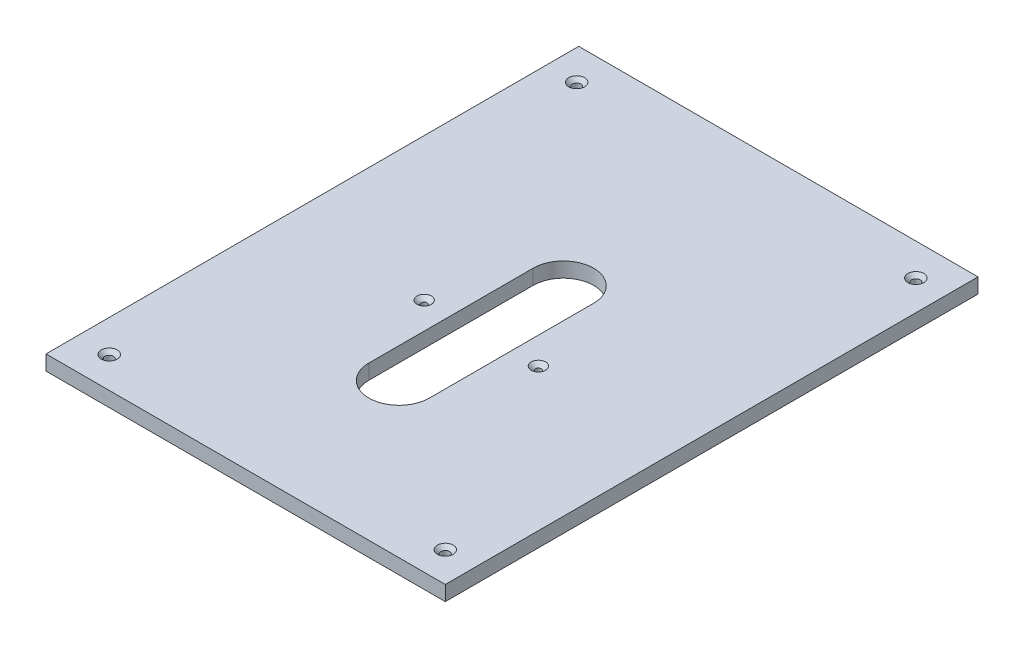
ISO-10303-21;
HEADER;
FILE_DESCRIPTION(('STEP AP214'),'2;1');
FILE_NAME('part.step','',(''),(''),'','','');
FILE_SCHEMA(('AUTOMOTIVE_DESIGN { 1 0 10303 214 1 1 1 1 }'));
ENDSEC;
DATA;
#1=APPLICATION_CONTEXT('core data for automotive mechanical design processes');
#2=APPLICATION_PROTOCOL_DEFINITION('international standard','automotive_design',2000,#1);
#3=PRODUCT_CONTEXT('',#1,'mechanical');
#4=PRODUCT('Part','Part','',(#3));
#5=PRODUCT_RELATED_PRODUCT_CATEGORY('part','',(#4));
#6=PRODUCT_DEFINITION_FORMATION('','',#4);
#7=PRODUCT_DEFINITION_CONTEXT('part definition',#1,'design');
#8=PRODUCT_DEFINITION('design','',#6,#7);
#9=PRODUCT_DEFINITION_SHAPE('','',#8);
#10=(LENGTH_UNIT() NAMED_UNIT(*) SI_UNIT(.MILLI.,.METRE.));
#11=(NAMED_UNIT(*) PLANE_ANGLE_UNIT() SI_UNIT($,.RADIAN.));
#12=(NAMED_UNIT(*) SI_UNIT($,.STERADIAN.) SOLID_ANGLE_UNIT());
#13=UNCERTAINTY_MEASURE_WITH_UNIT(LENGTH_MEASURE(1.E-05),#10,'distance_accuracy_value','');
#14=(GEOMETRIC_REPRESENTATION_CONTEXT(3) GLOBAL_UNCERTAINTY_ASSIGNED_CONTEXT((#13)) GLOBAL_UNIT_ASSIGNED_CONTEXT((#10,
#11,#12)) REPRESENTATION_CONTEXT('',''));
#15=CARTESIAN_POINT('',(0.,0.,0.));
#16=DIRECTION('',(0.,0.,1.));
#17=DIRECTION('',(1.,0.,0.));
#18=AXIS2_PLACEMENT_3D('',#15,#16,#17);
#19=CARTESIAN_POINT('',(79.,5.9,-105.4));
#20=DIRECTION('',(-1.,0.,0.));
#21=DIRECTION('',(0.,0.,1.));
#22=AXIS2_PLACEMENT_3D('',#19,#20,#21);
#23=PLANE('',#22);
#24=DIRECTION('',(0.,0.,-1.));
#25=VECTOR('',#24,1.);
#26=CARTESIAN_POINT('',(79.,0.,-105.4));
#27=LINE('',#26,#25);
#28=CARTESIAN_POINT('',(79.,0.,105.4));
#29=VERTEX_POINT('',#28);
#30=CARTESIAN_POINT('',(79.,0.,-105.4));
#31=VERTEX_POINT('',#30);
#32=EDGE_CURVE('E202',#29,#31,#27,.T.);
#33=ORIENTED_EDGE('',*,*,#32,.T.);
#34=DIRECTION('',(0.,-1.,0.));
#35=VECTOR('',#34,1.);
#36=CARTESIAN_POINT('',(79.,5.9,-105.4));
#37=LINE('',#36,#35);
#38=CARTESIAN_POINT('',(79.,5.9,-105.4));
#39=VERTEX_POINT('',#38);
#40=EDGE_CURVE('E11',#39,#31,#37,.T.);
#41=ORIENTED_EDGE('',*,*,#40,.F.);
#42=DIRECTION('',(0.,0.,-1.));
#43=VECTOR('',#42,1.);
#44=CARTESIAN_POINT('',(79.,5.9,-105.4));
#45=LINE('',#44,#43);
#46=CARTESIAN_POINT('',(79.,5.9,105.4));
#47=VERTEX_POINT('',#46);
#48=EDGE_CURVE('E191',#47,#39,#45,.T.);
#49=ORIENTED_EDGE('',*,*,#48,.F.);
#50=DIRECTION('',(0.,-1.,0.));
#51=VECTOR('',#50,1.);
#52=CARTESIAN_POINT('',(79.,5.9,105.4));
#53=LINE('',#52,#51);
#54=EDGE_CURVE('E201',#47,#29,#53,.T.);
#55=ORIENTED_EDGE('',*,*,#54,.T.);
#56=EDGE_LOOP('',(#33,#41,#49,#55));
#57=FACE_BOUND('',#56,.T.);
#58=ADVANCED_FACE('F37',(#57),#23,.F.);
#59=CARTESIAN_POINT('',(-79.,5.9,-105.4));
#60=DIRECTION('',(0.,0.,1.));
#61=DIRECTION('',(1.,0.,0.));
#62=AXIS2_PLACEMENT_3D('',#59,#60,#61);
#63=PLANE('',#62);
#64=DIRECTION('',(-1.,0.,0.));
#65=VECTOR('',#64,1.);
#66=CARTESIAN_POINT('',(-79.,0.,-105.4));
#67=LINE('',#66,#65);
#68=CARTESIAN_POINT('',(-79.,0.,-105.4));
#69=VERTEX_POINT('',#68);
#70=EDGE_CURVE('E205',#31,#69,#67,.T.);
#71=ORIENTED_EDGE('',*,*,#70,.T.);
#72=DIRECTION('',(0.,-1.,0.));
#73=VECTOR('',#72,1.);
#74=CARTESIAN_POINT('',(-79.,5.9,-105.4));
#75=LINE('',#74,#73);
#76=CARTESIAN_POINT('',(-79.,5.9,-105.4));
#77=VERTEX_POINT('',#76);
#78=EDGE_CURVE('E45',#77,#69,#75,.T.);
#79=ORIENTED_EDGE('',*,*,#78,.F.);
#80=DIRECTION('',(-1.,0.,0.));
#81=VECTOR('',#80,1.);
#82=CARTESIAN_POINT('',(-79.,5.9,-105.4));
#83=LINE('',#82,#81);
#84=EDGE_CURVE('E194',#39,#77,#83,.T.);
#85=ORIENTED_EDGE('',*,*,#84,.F.);
#86=ORIENTED_EDGE('',*,*,#40,.T.);
#87=EDGE_LOOP('',(#71,#79,#85,#86));
#88=FACE_BOUND('',#87,.T.);
#89=ADVANCED_FACE('F269',(#88),#63,.F.);
#90=CARTESIAN_POINT('',(-79.,5.9,-105.4));
#91=DIRECTION('',(1.,0.,0.));
#92=DIRECTION('',(0.,0.,-1.));
#93=AXIS2_PLACEMENT_3D('',#90,#91,#92);
#94=PLANE('',#93);
#95=DIRECTION('',(0.,0.,1.));
#96=VECTOR('',#95,1.);
#97=CARTESIAN_POINT('',(-79.,0.,-105.4));
#98=LINE('',#97,#96);
#99=CARTESIAN_POINT('',(-79.,0.,105.4));
#100=VERTEX_POINT('',#99);
#101=EDGE_CURVE('E207',#69,#100,#98,.T.);
#102=ORIENTED_EDGE('',*,*,#101,.T.);
#103=DIRECTION('',(0.,-1.,0.));
#104=VECTOR('',#103,1.);
#105=CARTESIAN_POINT('',(-79.,5.9,105.4));
#106=LINE('',#105,#104);
#107=CARTESIAN_POINT('',(-79.,5.9,105.4));
#108=VERTEX_POINT('',#107);
#109=EDGE_CURVE('E212',#108,#100,#106,.T.);
#110=ORIENTED_EDGE('',*,*,#109,.F.);
#111=DIRECTION('',(0.,0.,1.));
#112=VECTOR('',#111,1.);
#113=CARTESIAN_POINT('',(-79.,5.9,-105.4));
#114=LINE('',#113,#112);
#115=EDGE_CURVE('E197',#77,#108,#114,.T.);
#116=ORIENTED_EDGE('',*,*,#115,.F.);
#117=ORIENTED_EDGE('',*,*,#78,.T.);
#118=EDGE_LOOP('',(#102,#110,#116,#117));
#119=FACE_BOUND('',#118,.T.);
#120=ADVANCED_FACE('F274',(#119),#94,.F.);
#121=CARTESIAN_POINT('',(-79.,5.9,105.4));
#122=DIRECTION('',(0.,0.,-1.));
#123=DIRECTION('',(-1.,0.,0.));
#124=AXIS2_PLACEMENT_3D('',#121,#122,#123);
#125=PLANE('',#124);
#126=DIRECTION('',(1.,0.,0.));
#127=VECTOR('',#126,1.);
#128=CARTESIAN_POINT('',(-79.,0.,105.4));
#129=LINE('',#128,#127);
#130=EDGE_CURVE('E195',#100,#29,#129,.T.);
#131=ORIENTED_EDGE('',*,*,#130,.T.);
#132=ORIENTED_EDGE('',*,*,#54,.F.);
#133=DIRECTION('',(1.,0.,0.));
#134=VECTOR('',#133,1.);
#135=CARTESIAN_POINT('',(-79.,5.9,105.4));
#136=LINE('',#135,#134);
#137=EDGE_CURVE('E199',#108,#47,#136,.T.);
#138=ORIENTED_EDGE('',*,*,#137,.F.);
#139=ORIENTED_EDGE('',*,*,#109,.T.);
#140=EDGE_LOOP('',(#131,#132,#138,#139));
#141=FACE_BOUND('',#140,.T.);
#142=ADVANCED_FACE('F248',(#141),#125,.F.);
#143=CARTESIAN_POINT('',(0.,5.9,0.));
#144=DIRECTION('',(0.,1.,0.));
#145=DIRECTION('',(0.,0.,1.));
#146=AXIS2_PLACEMENT_3D('',#143,#144,#145);
#147=PLANE('',#146);
#148=CARTESIAN_POINT('',(-22.6,5.9,12.16));
#149=DIRECTION('',(0.,1.,0.));
#150=DIRECTION('',(0.,0.,1.));
#151=AXIS2_PLACEMENT_3D('',#148,#149,#150);
#152=CIRCLE('',#151,2.8575);
#153=CARTESIAN_POINT('',(-22.6,5.9,15.0175));
#154=VERTEX_POINT('',#153);
#155=EDGE_CURVE('E239',#154,#154,#152,.T.);
#156=ORIENTED_EDGE('',*,*,#155,.F.);
#157=EDGE_LOOP('',(#156));
#158=FACE_BOUND('',#157,.T.);
#159=CARTESIAN_POINT('',(22.6,5.9,12.16));
#160=DIRECTION('',(0.,1.,0.));
#161=DIRECTION('',(0.,0.,1.));
#162=AXIS2_PLACEMENT_3D('',#159,#160,#161);
#163=CIRCLE('',#162,2.8575);
#164=CARTESIAN_POINT('',(22.6,5.9,15.0175));
#165=VERTEX_POINT('',#164);
#166=EDGE_CURVE('E228',#165,#165,#163,.T.);
#167=ORIENTED_EDGE('',*,*,#166,.F.);
#168=EDGE_LOOP('',(#167));
#169=FACE_BOUND('',#168,.T.);
#170=CARTESIAN_POINT('',(-11.991361003824,5.9,44.66));
#171=CARTESIAN_POINT('',(-11.991361003824,5.9,68.642722007648));
#172=CARTESIAN_POINT('',(11.991361003824,5.9,68.642722007648));
#173=CARTESIAN_POINT('',(11.991361003824,5.9,44.66));
#174=(BOUNDED_CURVE() B_SPLINE_CURVE(3,(#170,#171,#172,#173),.UNSPECIFIED.,.F.,
.F.) B_SPLINE_CURVE_WITH_KNOTS((4,4),(0.,1.),
.UNSPECIFIED.) CURVE() GEOMETRIC_REPRESENTATION_ITEM() RATIONAL_B_SPLINE_CURVE((1.,
0.333333333333333,0.333333333333333,1.)) REPRESENTATION_ITEM(''));
#175=CARTESIAN_POINT('',(-11.991361003824,5.9,44.66));
#176=VERTEX_POINT('',#175);
#177=CARTESIAN_POINT('',(11.991361003824,5.9,44.66));
#178=VERTEX_POINT('',#177);
#179=EDGE_CURVE('E53',#176,#178,#174,.T.);
#180=ORIENTED_EDGE('',*,*,#179,.F.);
#181=DIRECTION('',(0.,0.,1.));
#182=VECTOR('',#181,1.);
#183=CARTESIAN_POINT('',(-11.991361003824,5.9,-20.34));
#184=LINE('',#183,#182);
#185=CARTESIAN_POINT('',(-11.991361003824,5.9,-20.34));
#186=VERTEX_POINT('',#185);
#187=EDGE_CURVE('E121',#186,#176,#184,.T.);
#188=ORIENTED_EDGE('',*,*,#187,.F.);
#189=CARTESIAN_POINT('',(11.991361003824,5.9,-20.34));
#190=CARTESIAN_POINT('',(11.991361003824,5.9,-44.322722007648));
#191=CARTESIAN_POINT('',(-11.991361003824,5.9,-44.322722007648));
#192=CARTESIAN_POINT('',(-11.991361003824,5.9,-20.34));
#193=(BOUNDED_CURVE() B_SPLINE_CURVE(3,(#189,#190,#191,#192),.UNSPECIFIED.,.F.,
.F.) B_SPLINE_CURVE_WITH_KNOTS((4,4),(0.,1.),
.UNSPECIFIED.) CURVE() GEOMETRIC_REPRESENTATION_ITEM() RATIONAL_B_SPLINE_CURVE((1.,
0.333333333333334,0.333333333333334,1.)) REPRESENTATION_ITEM(''));
#194=CARTESIAN_POINT('',(11.991361003824,5.9,-20.34));
#195=VERTEX_POINT('',#194);
#196=EDGE_CURVE('E124',#195,#186,#193,.T.);
#197=ORIENTED_EDGE('',*,*,#196,.F.);
#198=DIRECTION('',(0.,0.,-1.));
#199=VECTOR('',#198,1.);
#200=CARTESIAN_POINT('',(11.991361003824,5.9,44.66));
#201=LINE('',#200,#199);
#202=EDGE_CURVE('E145',#178,#195,#201,.T.);
#203=ORIENTED_EDGE('',*,*,#202,.F.);
#204=EDGE_LOOP('',(#180,#188,#197,#203));
#205=FACE_BOUND('',#204,.T.);
#206=CARTESIAN_POINT('',(67.1,5.9,-92.7));
#207=DIRECTION('',(0.,1.,0.));
#208=DIRECTION('',(0.,0.,1.));
#209=AXIS2_PLACEMENT_3D('',#206,#207,#208);
#210=CIRCLE('',#209,3.15);
#211=CARTESIAN_POINT('',(67.1,5.9,-89.55));
#212=VERTEX_POINT('',#211);
#213=EDGE_CURVE('E160',#212,#212,#210,.T.);
#214=ORIENTED_EDGE('',*,*,#213,.F.);
#215=EDGE_LOOP('',(#214));
#216=FACE_BOUND('',#215,.T.);
#217=CARTESIAN_POINT('',(67.1,5.9,93.4999999999999));
#218=DIRECTION('',(0.,1.,0.));
#219=DIRECTION('',(0.,0.,1.));
#220=AXIS2_PLACEMENT_3D('',#217,#218,#219);
#221=CIRCLE('',#220,3.15);
#222=CARTESIAN_POINT('',(67.1,5.9,96.6499999999999));
#223=VERTEX_POINT('',#222);
#224=EDGE_CURVE('E170',#223,#223,#221,.T.);
#225=ORIENTED_EDGE('',*,*,#224,.F.);
#226=EDGE_LOOP('',(#225));
#227=FACE_BOUND('',#226,.T.);
#228=CARTESIAN_POINT('',(-66.2839765904719,5.9,93.1));
#229=DIRECTION('',(0.,1.,0.));
#230=DIRECTION('',(0.,0.,1.));
#231=AXIS2_PLACEMENT_3D('',#228,#229,#230);
#232=CIRCLE('',#231,3.15);
#233=CARTESIAN_POINT('',(-66.2839765904719,5.9,96.2499999999999));
#234=VERTEX_POINT('',#233);
#235=EDGE_CURVE('E177',#234,#234,#232,.T.);
#236=ORIENTED_EDGE('',*,*,#235,.F.);
#237=EDGE_LOOP('',(#236));
#238=FACE_BOUND('',#237,.T.);
#239=CARTESIAN_POINT('',(-67.1,5.9,-92.7));
#240=DIRECTION('',(0.,1.,0.));
#241=DIRECTION('',(0.,0.,1.));
#242=AXIS2_PLACEMENT_3D('',#239,#240,#241);
#243=CIRCLE('',#242,3.15);
#244=CARTESIAN_POINT('',(-67.1,5.9,-89.55));
#245=VERTEX_POINT('',#244);
#246=EDGE_CURVE('E184',#245,#245,#243,.T.);
#247=ORIENTED_EDGE('',*,*,#246,.F.);
#248=EDGE_LOOP('',(#247));
#249=FACE_BOUND('',#248,.T.);
#250=ORIENTED_EDGE('',*,*,#48,.T.);
#251=ORIENTED_EDGE('',*,*,#84,.T.);
#252=ORIENTED_EDGE('',*,*,#115,.T.);
#253=ORIENTED_EDGE('',*,*,#137,.T.);
#254=EDGE_LOOP('',(#250,#251,#252,#253));
#255=FACE_BOUND('',#254,.T.);
#256=ADVANCED_FACE('F245',(#158,#169,#205,#216,#227,#238,#249,#255),#147,.T.);
#257=CARTESIAN_POINT('',(0.,0.,0.));
#258=DIRECTION('',(0.,1.,0.));
#259=DIRECTION('',(0.,0.,1.));
#260=AXIS2_PLACEMENT_3D('',#257,#258,#259);
#261=PLANE('',#260);
#262=CARTESIAN_POINT('',(-22.6,0.,12.16));
#263=DIRECTION('',(0.,1.,0.));
#264=DIRECTION('',(0.,0.,1.));
#265=AXIS2_PLACEMENT_3D('',#262,#263,#264);
#266=CIRCLE('',#265,1.1303);
#267=CARTESIAN_POINT('',(-22.6,0.,13.2903));
#268=VERTEX_POINT('',#267);
#269=EDGE_CURVE('E40',#268,#268,#266,.T.);
#270=ORIENTED_EDGE('',*,*,#269,.T.);
#271=EDGE_LOOP('',(#270));
#272=FACE_BOUND('',#271,.T.);
#273=CARTESIAN_POINT('',(22.6,0.,12.16));
#274=DIRECTION('',(0.,1.,0.));
#275=DIRECTION('',(0.,0.,1.));
#276=AXIS2_PLACEMENT_3D('',#273,#274,#275);
#277=CIRCLE('',#276,1.1303);
#278=CARTESIAN_POINT('',(22.6,0.,13.2903));
#279=VERTEX_POINT('',#278);
#280=EDGE_CURVE('E146',#279,#279,#277,.T.);
#281=ORIENTED_EDGE('',*,*,#280,.T.);
#282=EDGE_LOOP('',(#281));
#283=FACE_BOUND('',#282,.T.);
#284=DIRECTION('',(0.,0.,1.));
#285=VECTOR('',#284,1.);
#286=CARTESIAN_POINT('',(-11.991361003824,0.,-20.34));
#287=LINE('',#286,#285);
#288=CARTESIAN_POINT('',(-11.991361003824,0.,-20.34));
#289=VERTEX_POINT('',#288);
#290=CARTESIAN_POINT('',(-11.991361003824,0.,44.66));
#291=VERTEX_POINT('',#290);
#292=EDGE_CURVE('E111',#289,#291,#287,.T.);
#293=ORIENTED_EDGE('',*,*,#292,.T.);
#294=CARTESIAN_POINT('',(-11.991361003824,0.,44.66));
#295=CARTESIAN_POINT('',(-11.991361003824,0.,68.642722007648));
#296=CARTESIAN_POINT('',(11.991361003824,0.,68.642722007648));
#297=CARTESIAN_POINT('',(11.991361003824,0.,44.66));
#298=(BOUNDED_CURVE() B_SPLINE_CURVE(3,(#294,#295,#296,#297),.UNSPECIFIED.,.F.,
.F.) B_SPLINE_CURVE_WITH_KNOTS((4,4),(0.,1.),
.UNSPECIFIED.) CURVE() GEOMETRIC_REPRESENTATION_ITEM() RATIONAL_B_SPLINE_CURVE((1.,
0.333333333333333,0.333333333333333,1.)) REPRESENTATION_ITEM(''));
#299=CARTESIAN_POINT('',(11.991361003824,0.,44.66));
#300=VERTEX_POINT('',#299);
#301=EDGE_CURVE('E105',#291,#300,#298,.T.);
#302=ORIENTED_EDGE('',*,*,#301,.T.);
#303=DIRECTION('',(0.,0.,-1.));
#304=VECTOR('',#303,1.);
#305=CARTESIAN_POINT('',(11.991361003824,0.,44.66));
#306=LINE('',#305,#304);
#307=CARTESIAN_POINT('',(11.991361003824,0.,-20.34));
#308=VERTEX_POINT('',#307);
#309=EDGE_CURVE('E114',#300,#308,#306,.T.);
#310=ORIENTED_EDGE('',*,*,#309,.T.);
#311=CARTESIAN_POINT('',(11.991361003824,0.,-20.34));
#312=CARTESIAN_POINT('',(11.991361003824,0.,-44.322722007648));
#313=CARTESIAN_POINT('',(-11.991361003824,0.,-44.322722007648));
#314=CARTESIAN_POINT('',(-11.991361003824,0.,-20.34));
#315=(BOUNDED_CURVE() B_SPLINE_CURVE(3,(#311,#312,#313,#314),.UNSPECIFIED.,.F.,
.F.) B_SPLINE_CURVE_WITH_KNOTS((4,4),(0.,1.),
.UNSPECIFIED.) CURVE() GEOMETRIC_REPRESENTATION_ITEM() RATIONAL_B_SPLINE_CURVE((1.,
0.333333333333334,0.333333333333334,1.)) REPRESENTATION_ITEM(''));
#316=EDGE_CURVE('E61',#308,#289,#315,.T.);
#317=ORIENTED_EDGE('',*,*,#316,.T.);
#318=EDGE_LOOP('',(#293,#302,#310,#317));
#319=FACE_BOUND('',#318,.T.);
#320=CARTESIAN_POINT('',(67.1,0.,-92.7));
#321=DIRECTION('',(0.,1.,0.));
#322=DIRECTION('',(0.,0.,1.));
#323=AXIS2_PLACEMENT_3D('',#320,#321,#322);
#324=CIRCLE('',#323,1.69999999999999);
#325=CARTESIAN_POINT('',(67.1,0.,-91.));
#326=VERTEX_POINT('',#325);
#327=EDGE_CURVE('E169',#326,#326,#324,.T.);
#328=ORIENTED_EDGE('',*,*,#327,.T.);
#329=EDGE_LOOP('',(#328));
#330=FACE_BOUND('',#329,.T.);
#331=CARTESIAN_POINT('',(67.1,0.,93.4999999999999));
#332=DIRECTION('',(0.,1.,0.));
#333=DIRECTION('',(0.,0.,1.));
#334=AXIS2_PLACEMENT_3D('',#331,#332,#333);
#335=CIRCLE('',#334,1.69999999999999);
#336=CARTESIAN_POINT('',(67.1,0.,95.1999999999999));
#337=VERTEX_POINT('',#336);
#338=EDGE_CURVE('E176',#337,#337,#335,.T.);
#339=ORIENTED_EDGE('',*,*,#338,.T.);
#340=EDGE_LOOP('',(#339));
#341=FACE_BOUND('',#340,.T.);
#342=CARTESIAN_POINT('',(-66.2839765904719,0.,93.1));
#343=DIRECTION('',(0.,1.,0.));
#344=DIRECTION('',(0.,0.,1.));
#345=AXIS2_PLACEMENT_3D('',#342,#343,#344);
#346=CIRCLE('',#345,1.69999999999999);
#347=CARTESIAN_POINT('',(-66.2839765904719,0.,94.7999999999999));
#348=VERTEX_POINT('',#347);
#349=EDGE_CURVE('E183',#348,#348,#346,.T.);
#350=ORIENTED_EDGE('',*,*,#349,.T.);
#351=EDGE_LOOP('',(#350));
#352=FACE_BOUND('',#351,.T.);
#353=CARTESIAN_POINT('',(-67.1,0.,-92.7));
#354=DIRECTION('',(0.,1.,0.));
#355=DIRECTION('',(0.,0.,1.));
#356=AXIS2_PLACEMENT_3D('',#353,#354,#355);
#357=CIRCLE('',#356,1.69999999999999);
#358=CARTESIAN_POINT('',(-67.1,0.,-91.));
#359=VERTEX_POINT('',#358);
#360=EDGE_CURVE('E190',#359,#359,#357,.T.);
#361=ORIENTED_EDGE('',*,*,#360,.T.);
#362=EDGE_LOOP('',(#361));
#363=FACE_BOUND('',#362,.T.);
#364=ORIENTED_EDGE('',*,*,#32,.F.);
#365=ORIENTED_EDGE('',*,*,#130,.F.);
#366=ORIENTED_EDGE('',*,*,#101,.F.);
#367=ORIENTED_EDGE('',*,*,#70,.F.);
#368=EDGE_LOOP('',(#364,#365,#366,#367));
#369=FACE_BOUND('',#368,.T.);
#370=ADVANCED_FACE('F118',(#272,#283,#319,#330,#341,#352,#363,#369),#261,.F.);
#371=CARTESIAN_POINT('',(-67.1,5.9,-92.7));
#372=DIRECTION('',(0.,1.,0.));
#373=DIRECTION('',(0.,0.,1.));
#374=AXIS2_PLACEMENT_3D('',#371,#372,#373);
#375=CYLINDRICAL_SURFACE('',#374,1.69999999999999);
#376=CARTESIAN_POINT('',(-67.1,4.45,-92.7));
#377=DIRECTION('',(0.,1.,0.));
#378=DIRECTION('',(0.,0.,1.));
#379=AXIS2_PLACEMENT_3D('',#376,#377,#378);
#380=CIRCLE('',#379,1.69999999999999);
#381=CARTESIAN_POINT('',(-67.1,4.45,-91.));
#382=VERTEX_POINT('',#381);
#383=EDGE_CURVE('E187',#382,#382,#380,.T.);
#384=ORIENTED_EDGE('',*,*,#383,.T.);
#385=EDGE_LOOP('',(#384));
#386=FACE_BOUND('',#385,.T.);
#387=ORIENTED_EDGE('',*,*,#360,.F.);
#388=EDGE_LOOP('',(#387));
#389=FACE_BOUND('',#388,.T.);
#390=ADVANCED_FACE('F279',(#386,#389),#375,.F.);
#391=CARTESIAN_POINT('',(-67.1,5.9,-92.7));
#392=DIRECTION('',(0.,1.,0.));
#393=DIRECTION('',(0.,0.,1.));
#394=AXIS2_PLACEMENT_3D('',#391,#392,#393);
#395=CONICAL_SURFACE('',#394,3.15,0.78539816339745);
#396=ORIENTED_EDGE('',*,*,#383,.F.);
#397=EDGE_LOOP('',(#396));
#398=FACE_BOUND('',#397,.T.);
#399=ORIENTED_EDGE('',*,*,#246,.T.);
#400=EDGE_LOOP('',(#399));
#401=FACE_BOUND('',#400,.T.);
#402=ADVANCED_FACE('F285',(#398,#401),#395,.F.);
#403=CARTESIAN_POINT('',(-66.2839765904719,5.9,93.1));
#404=DIRECTION('',(0.,1.,0.));
#405=DIRECTION('',(0.,0.,1.));
#406=AXIS2_PLACEMENT_3D('',#403,#404,#405);
#407=CYLINDRICAL_SURFACE('',#406,1.69999999999999);
#408=CARTESIAN_POINT('',(-66.2839765904719,4.45,93.1));
#409=DIRECTION('',(0.,1.,0.));
#410=DIRECTION('',(0.,0.,1.));
#411=AXIS2_PLACEMENT_3D('',#408,#409,#410);
#412=CIRCLE('',#411,1.69999999999999);
#413=CARTESIAN_POINT('',(-66.2839765904719,4.45,94.7999999999999));
#414=VERTEX_POINT('',#413);
#415=EDGE_CURVE('E180',#414,#414,#412,.T.);
#416=ORIENTED_EDGE('',*,*,#415,.T.);
#417=EDGE_LOOP('',(#416));
#418=FACE_BOUND('',#417,.T.);
#419=ORIENTED_EDGE('',*,*,#349,.F.);
#420=EDGE_LOOP('',(#419));
#421=FACE_BOUND('',#420,.T.);
#422=ADVANCED_FACE('F426',(#418,#421),#407,.F.);
#423=CARTESIAN_POINT('',(-66.2839765904719,5.9,93.1));
#424=DIRECTION('',(0.,1.,0.));
#425=DIRECTION('',(0.,0.,1.));
#426=AXIS2_PLACEMENT_3D('',#423,#424,#425);
#427=CONICAL_SURFACE('',#426,3.15,0.78539816339745);
#428=ORIENTED_EDGE('',*,*,#415,.F.);
#429=EDGE_LOOP('',(#428));
#430=FACE_BOUND('',#429,.T.);
#431=ORIENTED_EDGE('',*,*,#235,.T.);
#432=EDGE_LOOP('',(#431));
#433=FACE_BOUND('',#432,.T.);
#434=ADVANCED_FACE('F418',(#430,#433),#427,.F.);
#435=CARTESIAN_POINT('',(67.1,5.9,93.4999999999999));
#436=DIRECTION('',(0.,1.,0.));
#437=DIRECTION('',(0.,0.,1.));
#438=AXIS2_PLACEMENT_3D('',#435,#436,#437);
#439=CYLINDRICAL_SURFACE('',#438,1.69999999999999);
#440=CARTESIAN_POINT('',(67.1,4.45,93.4999999999999));
#441=DIRECTION('',(0.,1.,0.));
#442=DIRECTION('',(0.,0.,1.));
#443=AXIS2_PLACEMENT_3D('',#440,#441,#442);
#444=CIRCLE('',#443,1.69999999999999);
#445=CARTESIAN_POINT('',(67.1,4.45,95.1999999999999));
#446=VERTEX_POINT('',#445);
#447=EDGE_CURVE('E173',#446,#446,#444,.T.);
#448=ORIENTED_EDGE('',*,*,#447,.T.);
#449=EDGE_LOOP('',(#448));
#450=FACE_BOUND('',#449,.T.);
#451=ORIENTED_EDGE('',*,*,#338,.F.);
#452=EDGE_LOOP('',(#451));
#453=FACE_BOUND('',#452,.T.);
#454=ADVANCED_FACE('F410',(#450,#453),#439,.F.);
#455=CARTESIAN_POINT('',(67.1,5.9,93.4999999999999));
#456=DIRECTION('',(0.,1.,0.));
#457=DIRECTION('',(0.,0.,1.));
#458=AXIS2_PLACEMENT_3D('',#455,#456,#457);
#459=CONICAL_SURFACE('',#458,3.15,0.78539816339745);
#460=ORIENTED_EDGE('',*,*,#447,.F.);
#461=EDGE_LOOP('',(#460));
#462=FACE_BOUND('',#461,.T.);
#463=ORIENTED_EDGE('',*,*,#224,.T.);
#464=EDGE_LOOP('',(#463));
#465=FACE_BOUND('',#464,.T.);
#466=ADVANCED_FACE('F402',(#462,#465),#459,.F.);
#467=CARTESIAN_POINT('',(67.1,5.9,-92.7));
#468=DIRECTION('',(0.,1.,0.));
#469=DIRECTION('',(0.,0.,1.));
#470=AXIS2_PLACEMENT_3D('',#467,#468,#469);
#471=CYLINDRICAL_SURFACE('',#470,1.69999999999999);
#472=CARTESIAN_POINT('',(67.1,4.45,-92.7));
#473=DIRECTION('',(0.,1.,0.));
#474=DIRECTION('',(0.,0.,1.));
#475=AXIS2_PLACEMENT_3D('',#472,#473,#474);
#476=CIRCLE('',#475,1.69999999999999);
#477=CARTESIAN_POINT('',(67.1,4.45,-91.));
#478=VERTEX_POINT('',#477);
#479=EDGE_CURVE('E166',#478,#478,#476,.T.);
#480=ORIENTED_EDGE('',*,*,#479,.T.);
#481=EDGE_LOOP('',(#480));
#482=FACE_BOUND('',#481,.T.);
#483=ORIENTED_EDGE('',*,*,#327,.F.);
#484=EDGE_LOOP('',(#483));
#485=FACE_BOUND('',#484,.T.);
#486=ADVANCED_FACE('F394',(#482,#485),#471,.F.);
#487=CARTESIAN_POINT('',(67.1,5.9,-92.7));
#488=DIRECTION('',(0.,1.,0.));
#489=DIRECTION('',(0.,0.,1.));
#490=AXIS2_PLACEMENT_3D('',#487,#488,#489);
#491=CONICAL_SURFACE('',#490,3.15,0.78539816339745);
#492=ORIENTED_EDGE('',*,*,#479,.F.);
#493=EDGE_LOOP('',(#492));
#494=FACE_BOUND('',#493,.T.);
#495=ORIENTED_EDGE('',*,*,#213,.T.);
#496=EDGE_LOOP('',(#495));
#497=FACE_BOUND('',#496,.T.);
#498=ADVANCED_FACE('F387',(#494,#497),#491,.F.);
#499=CARTESIAN_POINT('',(0.,0.,44.66));
#500=DIRECTION('',(0.,1.,0.));
#501=DIRECTION('',(0.,0.,1.));
#502=AXIS2_PLACEMENT_3D('',#499,#500,#501);
#503=CYLINDRICAL_SURFACE('',#502,11.991361003824);
#504=ORIENTED_EDGE('',*,*,#179,.T.);
#505=DIRECTION('',(0.,1.,0.));
#506=VECTOR('',#505,1.);
#507=CARTESIAN_POINT('',(11.991361003824,0.,44.66));
#508=LINE('',#507,#506);
#509=EDGE_CURVE('E101',#300,#178,#508,.T.);
#510=ORIENTED_EDGE('',*,*,#509,.F.);
#511=ORIENTED_EDGE('',*,*,#301,.F.);
#512=DIRECTION('',(0.,1.,0.));
#513=VECTOR('',#512,1.);
#514=CARTESIAN_POINT('',(-11.991361003824,0.,44.66));
#515=LINE('',#514,#513);
#516=EDGE_CURVE('E158',#291,#176,#515,.T.);
#517=ORIENTED_EDGE('',*,*,#516,.T.);
#518=EDGE_LOOP('',(#504,#510,#511,#517));
#519=FACE_BOUND('',#518,.T.);
#520=ADVANCED_FACE('F103',(#519),#503,.F.);
#521=CARTESIAN_POINT('',(-11.991361003824,0.,-20.34));
#522=DIRECTION('',(-1.,0.,0.));
#523=DIRECTION('',(0.,0.,1.));
#524=AXIS2_PLACEMENT_3D('',#521,#522,#523);
#525=PLANE('',#524);
#526=ORIENTED_EDGE('',*,*,#187,.T.);
#527=ORIENTED_EDGE('',*,*,#516,.F.);
#528=ORIENTED_EDGE('',*,*,#292,.F.);
#529=DIRECTION('',(0.,1.,0.));
#530=VECTOR('',#529,1.);
#531=CARTESIAN_POINT('',(-11.991361003824,0.,-20.34));
#532=LINE('',#531,#530);
#533=EDGE_CURVE('E161',#289,#186,#532,.T.);
#534=ORIENTED_EDGE('',*,*,#533,.T.);
#535=EDGE_LOOP('',(#526,#527,#528,#534));
#536=FACE_BOUND('',#535,.T.);
#537=ADVANCED_FACE('F373',(#536),#525,.F.);
#538=CARTESIAN_POINT('',(0.,0.,-20.34));
#539=DIRECTION('',(0.,1.,0.));
#540=DIRECTION('',(0.,0.,1.));
#541=AXIS2_PLACEMENT_3D('',#538,#539,#540);
#542=CYLINDRICAL_SURFACE('',#541,11.991361003824);
#543=ORIENTED_EDGE('',*,*,#196,.T.);
#544=ORIENTED_EDGE('',*,*,#533,.F.);
#545=ORIENTED_EDGE('',*,*,#316,.F.);
#546=DIRECTION('',(0.,1.,0.));
#547=VECTOR('',#546,1.);
#548=CARTESIAN_POINT('',(11.991361003824,0.,-20.34));
#549=LINE('',#548,#547);
#550=EDGE_CURVE('E110',#308,#195,#549,.T.);
#551=ORIENTED_EDGE('',*,*,#550,.T.);
#552=EDGE_LOOP('',(#543,#544,#545,#551));
#553=FACE_BOUND('',#552,.T.);
#554=ADVANCED_FACE('F369',(#553),#542,.F.);
#555=CARTESIAN_POINT('',(11.991361003824,0.,44.66));
#556=DIRECTION('',(1.,0.,0.));
#557=DIRECTION('',(0.,0.,-1.));
#558=AXIS2_PLACEMENT_3D('',#555,#556,#557);
#559=PLANE('',#558);
#560=ORIENTED_EDGE('',*,*,#202,.T.);
#561=ORIENTED_EDGE('',*,*,#550,.F.);
#562=ORIENTED_EDGE('',*,*,#309,.F.);
#563=ORIENTED_EDGE('',*,*,#509,.T.);
#564=EDGE_LOOP('',(#560,#561,#562,#563));
#565=FACE_BOUND('',#564,.T.);
#566=ADVANCED_FACE('F115',(#565),#559,.F.);
#567=CARTESIAN_POINT('',(22.6,5.9,12.16));
#568=DIRECTION('',(0.,1.,0.));
#569=DIRECTION('',(0.,0.,1.));
#570=AXIS2_PLACEMENT_3D('',#567,#568,#569);
#571=CYLINDRICAL_SURFACE('',#570,1.1303);
#572=CARTESIAN_POINT('',(22.6,4.4507071170306,12.16));
#573=DIRECTION('',(0.,1.,0.));
#574=DIRECTION('',(0.,0.,1.));
#575=AXIS2_PLACEMENT_3D('',#572,#573,#574);
#576=CIRCLE('',#575,1.1303);
#577=CARTESIAN_POINT('',(22.6,4.4507071170306,13.2903));
#578=VERTEX_POINT('',#577);
#579=EDGE_CURVE('E129',#578,#578,#576,.T.);
#580=ORIENTED_EDGE('',*,*,#579,.T.);
#581=EDGE_LOOP('',(#580));
#582=FACE_BOUND('',#581,.T.);
#583=ORIENTED_EDGE('',*,*,#280,.F.);
#584=EDGE_LOOP('',(#583));
#585=FACE_BOUND('',#584,.T.);
#586=ADVANCED_FACE('F322',(#582,#585),#571,.F.);
#587=CARTESIAN_POINT('',(22.6,5.9,12.16));
#588=DIRECTION('',(0.,1.,0.));
#589=DIRECTION('',(0.,0.,1.));
#590=AXIS2_PLACEMENT_3D('',#587,#588,#589);
#591=CONICAL_SURFACE('',#590,2.8575,0.872664625997164);
#592=ORIENTED_EDGE('',*,*,#579,.F.);
#593=EDGE_LOOP('',(#592));
#594=FACE_BOUND('',#593,.T.);
#595=ORIENTED_EDGE('',*,*,#166,.T.);
#596=EDGE_LOOP('',(#595));
#597=FACE_BOUND('',#596,.T.);
#598=ADVANCED_FACE('F328',(#594,#597),#591,.F.);
#599=CARTESIAN_POINT('',(-22.6,5.9,12.16));
#600=DIRECTION('',(0.,1.,0.));
#601=DIRECTION('',(0.,0.,1.));
#602=AXIS2_PLACEMENT_3D('',#599,#600,#601);
#603=CYLINDRICAL_SURFACE('',#602,1.1303);
#604=CARTESIAN_POINT('',(-22.6,4.4507071170306,12.16));
#605=DIRECTION('',(0.,1.,0.));
#606=DIRECTION('',(0.,0.,1.));
#607=AXIS2_PLACEMENT_3D('',#604,#605,#606);
#608=CIRCLE('',#607,1.1303);
#609=CARTESIAN_POINT('',(-22.6,4.4507071170306,13.2903));
#610=VERTEX_POINT('',#609);
#611=EDGE_CURVE('E235',#610,#610,#608,.T.);
#612=ORIENTED_EDGE('',*,*,#611,.T.);
#613=EDGE_LOOP('',(#612));
#614=FACE_BOUND('',#613,.T.);
#615=ORIENTED_EDGE('',*,*,#269,.F.);
#616=EDGE_LOOP('',(#615));
#617=FACE_BOUND('',#616,.T.);
#618=ADVANCED_FACE('F339',(#614,#617),#603,.F.);
#619=CARTESIAN_POINT('',(-22.6,5.9,12.16));
#620=DIRECTION('',(0.,1.,0.));
#621=DIRECTION('',(0.,0.,1.));
#622=AXIS2_PLACEMENT_3D('',#619,#620,#621);
#623=CONICAL_SURFACE('',#622,2.8575,0.872664625997164);
#624=ORIENTED_EDGE('',*,*,#611,.F.);
#625=EDGE_LOOP('',(#624));
#626=FACE_BOUND('',#625,.T.);
#627=ORIENTED_EDGE('',*,*,#155,.T.);
#628=EDGE_LOOP('',(#627));
#629=FACE_BOUND('',#628,.T.);
#630=ADVANCED_FACE('F243',(#626,#629),#623,.F.);
#631=CLOSED_SHELL('',(#58,#89,#120,#142,#256,#370,#390,#402,#422,#434,#454,#466,#486,#498,#520,
#537,#554,#566,#586,#598,#618,#630));
#632=MANIFOLD_SOLID_BREP('B2',#631);
#633=ADVANCED_BREP_SHAPE_REPRESENTATION('',(#18,#632),#14);
#634=SHAPE_DEFINITION_REPRESENTATION(#9,#633);
ENDSEC;
END-ISO-10303-21;
